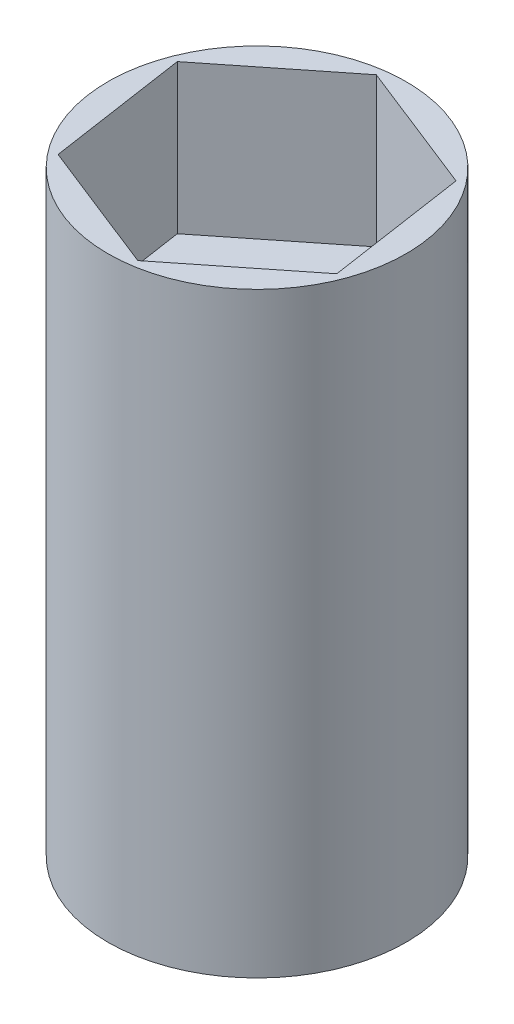
ISO-10303-21;
HEADER;
FILE_DESCRIPTION(('STEP AP214'),'2;1');
FILE_NAME('part.step','',(''),(''),'','','');
FILE_SCHEMA(('AUTOMOTIVE_DESIGN { 1 0 10303 214 1 1 1 1 }'));
ENDSEC;
DATA;
#1=APPLICATION_CONTEXT('core data for automotive mechanical design processes');
#2=APPLICATION_PROTOCOL_DEFINITION('international standard','automotive_design',2000,#1);
#3=PRODUCT_CONTEXT('',#1,'mechanical');
#4=PRODUCT('Part','Part','',(#3));
#5=PRODUCT_RELATED_PRODUCT_CATEGORY('part','',(#4));
#6=PRODUCT_DEFINITION_FORMATION('','',#4);
#7=PRODUCT_DEFINITION_CONTEXT('part definition',#1,'design');
#8=PRODUCT_DEFINITION('design','',#6,#7);
#9=PRODUCT_DEFINITION_SHAPE('','',#8);
#10=(LENGTH_UNIT() NAMED_UNIT(*) SI_UNIT(.MILLI.,.METRE.));
#11=(NAMED_UNIT(*) PLANE_ANGLE_UNIT() SI_UNIT($,.RADIAN.));
#12=(NAMED_UNIT(*) SI_UNIT($,.STERADIAN.) SOLID_ANGLE_UNIT());
#13=UNCERTAINTY_MEASURE_WITH_UNIT(LENGTH_MEASURE(1.E-05),#10,'distance_accuracy_value','');
#14=(GEOMETRIC_REPRESENTATION_CONTEXT(3) GLOBAL_UNCERTAINTY_ASSIGNED_CONTEXT((#13)) GLOBAL_UNIT_ASSIGNED_CONTEXT((#10,
#11,#12)) REPRESENTATION_CONTEXT('',''));
#15=CARTESIAN_POINT('',(0.,0.,0.));
#16=DIRECTION('',(0.,0.,1.));
#17=DIRECTION('',(1.,0.,0.));
#18=AXIS2_PLACEMENT_3D('',#15,#16,#17);
#19=CARTESIAN_POINT('',(0.,8.,0.));
#20=DIRECTION('',(0.,-1.,0.));
#21=DIRECTION('',(0.,0.,-1.));
#22=AXIS2_PLACEMENT_3D('',#19,#20,#21);
#23=CYLINDRICAL_SURFACE('',#22,2.);
#24=CARTESIAN_POINT('',(0.,8.,0.));
#25=DIRECTION('',(0.,1.,0.));
#26=DIRECTION('',(0.,0.,1.));
#27=AXIS2_PLACEMENT_3D('',#24,#25,#26);
#28=CIRCLE('',#27,2.);
#29=CARTESIAN_POINT('',(0.,8.,2.));
#30=VERTEX_POINT('',#29);
#31=EDGE_CURVE('E11',#30,#30,#28,.T.);
#32=ORIENTED_EDGE('',*,*,#31,.F.);
#33=EDGE_LOOP('',(#32));
#34=FACE_BOUND('',#33,.T.);
#35=CARTESIAN_POINT('',(0.,0.,0.));
#36=DIRECTION('',(0.,1.,0.));
#37=DIRECTION('',(0.,0.,1.));
#38=AXIS2_PLACEMENT_3D('',#35,#36,#37);
#39=CIRCLE('',#38,2.);
#40=CARTESIAN_POINT('',(0.,0.,2.));
#41=VERTEX_POINT('',#40);
#42=EDGE_CURVE('E48',#41,#41,#39,.T.);
#43=ORIENTED_EDGE('',*,*,#42,.T.);
#44=EDGE_LOOP('',(#43));
#45=FACE_BOUND('',#44,.T.);
#46=ADVANCED_FACE('F45',(#34,#45),#23,.T.);
#47=CARTESIAN_POINT('',(0.,8.,0.));
#48=DIRECTION('',(0.,1.,0.));
#49=DIRECTION('',(0.,0.,1.));
#50=AXIS2_PLACEMENT_3D('',#47,#48,#49);
#51=PLANE('',#50);
#52=DIRECTION('',(0.147081633028893,0.,0.989124356805328));
#53=VECTOR('',#52,1.);
#54=CARTESIAN_POINT('',(-1.76728051031863,8.,-0.697652920762131));
#55=LINE('',#54,#53);
#56=CARTESIAN_POINT('',(-1.76728051031863,8.,-0.697652920762131));
#57=VERTEX_POINT('',#56);
#58=CARTESIAN_POINT('',(-1.48782540756373,8.,1.18168335716799));
#59=VERTEX_POINT('',#58);
#60=EDGE_CURVE('E60',#57,#59,#55,.T.);
#61=ORIENTED_EDGE('',*,*,#60,.F.);
#62=DIRECTION('',(-0.783066003980911,0.,0.621938609035786));
#63=VECTOR('',#62,1.);
#64=CARTESIAN_POINT('',(-0.279455102754896,8.,-1.87933627793012));
#65=LINE('',#64,#63);
#66=CARTESIAN_POINT('',(-0.279455102754896,8.,-1.87933627793012));
#67=VERTEX_POINT('',#66);
#68=EDGE_CURVE('E153',#67,#57,#65,.T.);
#69=ORIENTED_EDGE('',*,*,#68,.F.);
#70=DIRECTION('',(-0.930147637009804,0.,-0.367185747769543));
#71=VECTOR('',#70,1.);
#72=CARTESIAN_POINT('',(1.48782540756373,8.,-1.18168335716799));
#73=LINE('',#72,#71);
#74=CARTESIAN_POINT('',(1.48782540756373,8.,-1.18168335716799));
#75=VERTEX_POINT('',#74);
#76=EDGE_CURVE('E150',#75,#67,#73,.T.);
#77=ORIENTED_EDGE('',*,*,#76,.F.);
#78=DIRECTION('',(-0.147081633028893,0.,-0.989124356805328));
#79=VECTOR('',#78,1.);
#80=CARTESIAN_POINT('',(1.76728051031863,8.,0.69765292076213));
#81=LINE('',#80,#79);
#82=CARTESIAN_POINT('',(1.76728051031863,8.,0.69765292076213));
#83=VERTEX_POINT('',#82);
#84=EDGE_CURVE('E108',#83,#75,#81,.T.);
#85=ORIENTED_EDGE('',*,*,#84,.F.);
#86=DIRECTION('',(0.783066003980911,0.,-0.621938609035786));
#87=VECTOR('',#86,1.);
#88=CARTESIAN_POINT('',(0.279455102754896,8.,1.87933627793012));
#89=LINE('',#88,#87);
#90=CARTESIAN_POINT('',(0.279455102754896,8.,1.87933627793012));
#91=VERTEX_POINT('',#90);
#92=EDGE_CURVE('E144',#91,#83,#89,.T.);
#93=ORIENTED_EDGE('',*,*,#92,.F.);
#94=DIRECTION('',(0.930147637009804,0.,0.367185747769543));
#95=VECTOR('',#94,1.);
#96=CARTESIAN_POINT('',(-1.48782540756373,8.,1.18168335716799));
#97=LINE('',#96,#95);
#98=EDGE_CURVE('E140',#59,#91,#97,.T.);
#99=ORIENTED_EDGE('',*,*,#98,.F.);
#100=EDGE_LOOP('',(#61,#69,#77,#85,#93,#99));
#101=FACE_BOUND('',#100,.T.);
#102=ORIENTED_EDGE('',*,*,#31,.T.);
#103=EDGE_LOOP('',(#102));
#104=FACE_BOUND('',#103,.T.);
#105=ADVANCED_FACE('F172',(#101,#104),#51,.T.);
#106=CARTESIAN_POINT('',(0.,0.,0.));
#107=DIRECTION('',(0.,1.,0.));
#108=DIRECTION('',(0.,0.,1.));
#109=AXIS2_PLACEMENT_3D('',#106,#107,#108);
#110=PLANE('',#109);
#111=ORIENTED_EDGE('',*,*,#42,.F.);
#112=EDGE_LOOP('',(#111));
#113=FACE_BOUND('',#112,.T.);
#114=ADVANCED_FACE('F183',(#113),#110,.F.);
#115=CARTESIAN_POINT('',(-1.76728051031863,6.,-0.697652920762131));
#116=DIRECTION('',(-0.989124356805328,0.,0.147081633028893));
#117=DIRECTION('',(0.147081633028893,0.,0.989124356805328));
#118=AXIS2_PLACEMENT_3D('',#115,#116,#117);
#119=PLANE('',#118);
#120=ORIENTED_EDGE('',*,*,#60,.T.);
#121=DIRECTION('',(0.,1.,0.));
#122=VECTOR('',#121,1.);
#123=CARTESIAN_POINT('',(-1.48782540756373,6.,1.18168335716799));
#124=LINE('',#123,#122);
#125=CARTESIAN_POINT('',(-1.48782540756373,6.,1.18168335716799));
#126=VERTEX_POINT('',#125);
#127=EDGE_CURVE('E90',#126,#59,#124,.T.);
#128=ORIENTED_EDGE('',*,*,#127,.F.);
#129=DIRECTION('',(0.147081633028893,0.,0.989124356805328));
#130=VECTOR('',#129,1.);
#131=CARTESIAN_POINT('',(-1.76728051031863,6.,-0.697652920762131));
#132=LINE('',#131,#130);
#133=CARTESIAN_POINT('',(-1.76728051031863,6.,-0.697652920762131));
#134=VERTEX_POINT('',#133);
#135=EDGE_CURVE('E156',#134,#126,#132,.T.);
#136=ORIENTED_EDGE('',*,*,#135,.F.);
#137=DIRECTION('',(0.,1.,0.));
#138=VECTOR('',#137,1.);
#139=CARTESIAN_POINT('',(-1.76728051031863,6.,-0.697652920762131));
#140=LINE('',#139,#138);
#141=EDGE_CURVE('E68',#134,#57,#140,.T.);
#142=ORIENTED_EDGE('',*,*,#141,.T.);
#143=EDGE_LOOP('',(#120,#128,#136,#142));
#144=FACE_BOUND('',#143,.T.);
#145=ADVANCED_FACE('F180',(#144),#119,.F.);
#146=CARTESIAN_POINT('',(-0.279455102754896,6.,-1.87933627793012));
#147=DIRECTION('',(-0.621938609035786,0.,-0.783066003980911));
#148=DIRECTION('',(-0.783066003980911,0.,0.621938609035786));
#149=AXIS2_PLACEMENT_3D('',#146,#147,#148);
#150=PLANE('',#149);
#151=ORIENTED_EDGE('',*,*,#68,.T.);
#152=ORIENTED_EDGE('',*,*,#141,.F.);
#153=DIRECTION('',(-0.783066003980911,0.,0.621938609035786));
#154=VECTOR('',#153,1.);
#155=CARTESIAN_POINT('',(-0.279455102754896,6.,-1.87933627793012));
#156=LINE('',#155,#154);
#157=CARTESIAN_POINT('',(-0.279455102754896,6.,-1.87933627793012));
#158=VERTEX_POINT('',#157);
#159=EDGE_CURVE('E122',#158,#134,#156,.T.);
#160=ORIENTED_EDGE('',*,*,#159,.F.);
#161=DIRECTION('',(0.,1.,0.));
#162=VECTOR('',#161,1.);
#163=CARTESIAN_POINT('',(-0.279455102754896,6.,-1.87933627793012));
#164=LINE('',#163,#162);
#165=EDGE_CURVE('E113',#158,#67,#164,.T.);
#166=ORIENTED_EDGE('',*,*,#165,.T.);
#167=EDGE_LOOP('',(#151,#152,#160,#166));
#168=FACE_BOUND('',#167,.T.);
#169=ADVANCED_FACE('F182',(#168),#150,.F.);
#170=CARTESIAN_POINT('',(1.48782540756373,6.,-1.18168335716799));
#171=DIRECTION('',(0.367185747769543,0.,-0.930147637009804));
#172=DIRECTION('',(-0.930147637009804,0.,-0.367185747769543));
#173=AXIS2_PLACEMENT_3D('',#170,#171,#172);
#174=PLANE('',#173);
#175=ORIENTED_EDGE('',*,*,#76,.T.);
#176=ORIENTED_EDGE('',*,*,#165,.F.);
#177=DIRECTION('',(-0.930147637009804,0.,-0.367185747769543));
#178=VECTOR('',#177,1.);
#179=CARTESIAN_POINT('',(1.48782540756373,6.,-1.18168335716799));
#180=LINE('',#179,#178);
#181=CARTESIAN_POINT('',(1.48782540756373,6.,-1.18168335716799));
#182=VERTEX_POINT('',#181);
#183=EDGE_CURVE('E117',#182,#158,#180,.T.);
#184=ORIENTED_EDGE('',*,*,#183,.F.);
#185=DIRECTION('',(0.,1.,0.));
#186=VECTOR('',#185,1.);
#187=CARTESIAN_POINT('',(1.48782540756373,6.,-1.18168335716799));
#188=LINE('',#187,#186);
#189=EDGE_CURVE('E101',#182,#75,#188,.T.);
#190=ORIENTED_EDGE('',*,*,#189,.T.);
#191=EDGE_LOOP('',(#175,#176,#184,#190));
#192=FACE_BOUND('',#191,.T.);
#193=ADVANCED_FACE('F118',(#192),#174,.F.);
#194=CARTESIAN_POINT('',(1.76728051031863,6.,0.69765292076213));
#195=DIRECTION('',(0.989124356805328,0.,-0.147081633028893));
#196=DIRECTION('',(-0.147081633028893,0.,-0.989124356805328));
#197=AXIS2_PLACEMENT_3D('',#194,#195,#196);
#198=PLANE('',#197);
#199=ORIENTED_EDGE('',*,*,#84,.T.);
#200=ORIENTED_EDGE('',*,*,#189,.F.);
#201=DIRECTION('',(-0.147081633028893,0.,-0.989124356805328));
#202=VECTOR('',#201,1.);
#203=CARTESIAN_POINT('',(1.76728051031863,6.,0.69765292076213));
#204=LINE('',#203,#202);
#205=CARTESIAN_POINT('',(1.76728051031863,6.,0.69765292076213));
#206=VERTEX_POINT('',#205);
#207=EDGE_CURVE('E105',#206,#182,#204,.T.);
#208=ORIENTED_EDGE('',*,*,#207,.F.);
#209=DIRECTION('',(0.,1.,0.));
#210=VECTOR('',#209,1.);
#211=CARTESIAN_POINT('',(1.76728051031863,6.,0.69765292076213));
#212=LINE('',#211,#210);
#213=EDGE_CURVE('E114',#206,#83,#212,.T.);
#214=ORIENTED_EDGE('',*,*,#213,.T.);
#215=EDGE_LOOP('',(#199,#200,#208,#214));
#216=FACE_BOUND('',#215,.T.);
#217=ADVANCED_FACE('F103',(#216),#198,.F.);
#218=CARTESIAN_POINT('',(0.279455102754896,6.,1.87933627793012));
#219=DIRECTION('',(0.621938609035786,0.,0.783066003980911));
#220=DIRECTION('',(0.783066003980911,0.,-0.621938609035786));
#221=AXIS2_PLACEMENT_3D('',#218,#219,#220);
#222=PLANE('',#221);
#223=ORIENTED_EDGE('',*,*,#92,.T.);
#224=ORIENTED_EDGE('',*,*,#213,.F.);
#225=DIRECTION('',(0.783066003980911,0.,-0.621938609035786));
#226=VECTOR('',#225,1.);
#227=CARTESIAN_POINT('',(0.279455102754896,6.,1.87933627793012));
#228=LINE('',#227,#226);
#229=CARTESIAN_POINT('',(0.279455102754896,6.,1.87933627793012));
#230=VERTEX_POINT('',#229);
#231=EDGE_CURVE('E128',#230,#206,#228,.T.);
#232=ORIENTED_EDGE('',*,*,#231,.F.);
#233=DIRECTION('',(0.,1.,0.));
#234=VECTOR('',#233,1.);
#235=CARTESIAN_POINT('',(0.279455102754896,6.,1.87933627793012));
#236=LINE('',#235,#234);
#237=EDGE_CURVE('E163',#230,#91,#236,.T.);
#238=ORIENTED_EDGE('',*,*,#237,.T.);
#239=EDGE_LOOP('',(#223,#224,#232,#238));
#240=FACE_BOUND('',#239,.T.);
#241=ADVANCED_FACE('F176',(#240),#222,.F.);
#242=CARTESIAN_POINT('',(-1.48782540756373,6.,1.18168335716799));
#243=DIRECTION('',(-0.367185747769543,0.,0.930147637009804));
#244=DIRECTION('',(0.930147637009804,0.,0.367185747769543));
#245=AXIS2_PLACEMENT_3D('',#242,#243,#244);
#246=PLANE('',#245);
#247=ORIENTED_EDGE('',*,*,#98,.T.);
#248=ORIENTED_EDGE('',*,*,#237,.F.);
#249=DIRECTION('',(0.930147637009804,0.,0.367185747769543));
#250=VECTOR('',#249,1.);
#251=CARTESIAN_POINT('',(-1.48782540756373,6.,1.18168335716799));
#252=LINE('',#251,#250);
#253=EDGE_CURVE('E132',#126,#230,#252,.T.);
#254=ORIENTED_EDGE('',*,*,#253,.F.);
#255=ORIENTED_EDGE('',*,*,#127,.T.);
#256=EDGE_LOOP('',(#247,#248,#254,#255));
#257=FACE_BOUND('',#256,.T.);
#258=ADVANCED_FACE('F169',(#257),#246,.F.);
#259=CARTESIAN_POINT('',(0.,6.,0.));
#260=DIRECTION('',(0.,1.,0.));
#261=DIRECTION('',(0.,0.,1.));
#262=AXIS2_PLACEMENT_3D('',#259,#260,#261);
#263=PLANE('',#262);
#264=ORIENTED_EDGE('',*,*,#135,.T.);
#265=ORIENTED_EDGE('',*,*,#253,.T.);
#266=ORIENTED_EDGE('',*,*,#231,.T.);
#267=ORIENTED_EDGE('',*,*,#207,.T.);
#268=ORIENTED_EDGE('',*,*,#183,.T.);
#269=ORIENTED_EDGE('',*,*,#159,.T.);
#270=EDGE_LOOP('',(#264,#265,#266,#267,#268,#269));
#271=FACE_BOUND('',#270,.T.);
#272=ADVANCED_FACE('F125',(#271),#263,.T.);
#273=CLOSED_SHELL('',(#46,#105,#114,#145,#169,#193,#217,#241,#258,#272));
#274=MANIFOLD_SOLID_BREP('B2',#273);
#275=ADVANCED_BREP_SHAPE_REPRESENTATION('',(#18,#274),#14);
#276=SHAPE_DEFINITION_REPRESENTATION(#9,#275);
ENDSEC;
END-ISO-10303-21;
